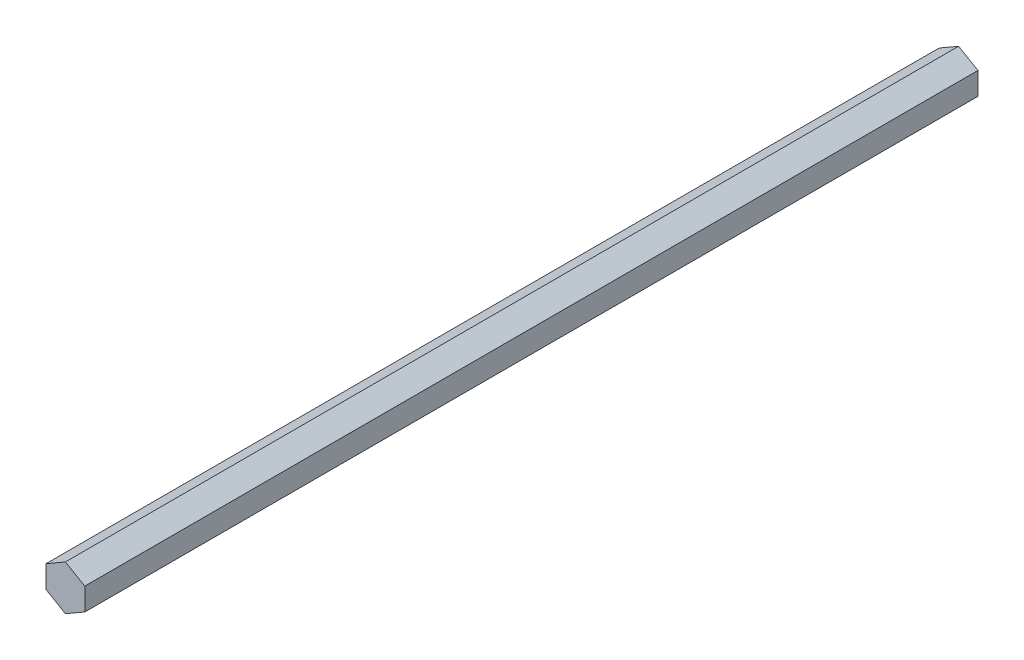
ISO-10303-21;
HEADER;
FILE_DESCRIPTION(('STEP AP214'),'2;1');
FILE_NAME('part.step','',(''),(''),'','','');
FILE_SCHEMA(('AUTOMOTIVE_DESIGN { 1 0 10303 214 1 1 1 1 }'));
ENDSEC;
DATA;
#1=APPLICATION_CONTEXT('core data for automotive mechanical design processes');
#2=APPLICATION_PROTOCOL_DEFINITION('international standard','automotive_design',2000,#1);
#3=PRODUCT_CONTEXT('',#1,'mechanical');
#4=PRODUCT('Part','Part','',(#3));
#5=PRODUCT_RELATED_PRODUCT_CATEGORY('part','',(#4));
#6=PRODUCT_DEFINITION_FORMATION('','',#4);
#7=PRODUCT_DEFINITION_CONTEXT('part definition',#1,'design');
#8=PRODUCT_DEFINITION('design','',#6,#7);
#9=PRODUCT_DEFINITION_SHAPE('','',#8);
#10=(LENGTH_UNIT() NAMED_UNIT(*) SI_UNIT(.MILLI.,.METRE.));
#11=(NAMED_UNIT(*) PLANE_ANGLE_UNIT() SI_UNIT($,.RADIAN.));
#12=(NAMED_UNIT(*) SI_UNIT($,.STERADIAN.) SOLID_ANGLE_UNIT());
#13=UNCERTAINTY_MEASURE_WITH_UNIT(LENGTH_MEASURE(1.E-05),#10,'distance_accuracy_value','');
#14=(GEOMETRIC_REPRESENTATION_CONTEXT(3) GLOBAL_UNCERTAINTY_ASSIGNED_CONTEXT((#13)) GLOBAL_UNIT_ASSIGNED_CONTEXT((#10,
#11,#12)) REPRESENTATION_CONTEXT('',''));
#15=CARTESIAN_POINT('',(0.,0.,0.));
#16=DIRECTION('',(0.,0.,1.));
#17=DIRECTION('',(1.,0.,0.));
#18=AXIS2_PLACEMENT_3D('',#15,#16,#17);
#19=CARTESIAN_POINT('',(6.35,-3.66617420935413,292.1));
#20=DIRECTION('',(-1.,0.,0.));
#21=DIRECTION('',(0.,-1.,0.));
#22=AXIS2_PLACEMENT_3D('',#19,#20,#21);
#23=PLANE('',#22);
#24=DIRECTION('',(0.,1.,0.));
#25=VECTOR('',#24,1.);
#26=CARTESIAN_POINT('',(6.35,-3.66617420935413,0.));
#27=LINE('',#26,#25);
#28=CARTESIAN_POINT('',(6.35,-3.66617420935413,0.));
#29=VERTEX_POINT('',#28);
#30=CARTESIAN_POINT('',(6.35,3.66617420935413,0.));
#31=VERTEX_POINT('',#30);
#32=EDGE_CURVE('E120',#29,#31,#27,.T.);
#33=ORIENTED_EDGE('',*,*,#32,.T.);
#34=DIRECTION('',(0.,0.,-1.));
#35=VECTOR('',#34,1.);
#36=CARTESIAN_POINT('',(6.35,3.66617420935413,292.1));
#37=LINE('',#36,#35);
#38=CARTESIAN_POINT('',(6.35,3.66617420935413,292.1));
#39=VERTEX_POINT('',#38);
#40=EDGE_CURVE('E11',#39,#31,#37,.T.);
#41=ORIENTED_EDGE('',*,*,#40,.F.);
#42=DIRECTION('',(0.,1.,0.));
#43=VECTOR('',#42,1.);
#44=CARTESIAN_POINT('',(6.35,-3.66617420935413,292.1));
#45=LINE('',#44,#43);
#46=CARTESIAN_POINT('',(6.35,-3.66617420935413,292.1));
#47=VERTEX_POINT('',#46);
#48=EDGE_CURVE('E130',#47,#39,#45,.T.);
#49=ORIENTED_EDGE('',*,*,#48,.F.);
#50=DIRECTION('',(0.,0.,-1.));
#51=VECTOR('',#50,1.);
#52=CARTESIAN_POINT('',(6.35,-3.66617420935413,292.1));
#53=LINE('',#52,#51);
#54=EDGE_CURVE('E116',#47,#29,#53,.T.);
#55=ORIENTED_EDGE('',*,*,#54,.T.);
#56=EDGE_LOOP('',(#33,#41,#49,#55));
#57=FACE_BOUND('',#56,.T.);
#58=ADVANCED_FACE('F36',(#57),#23,.F.);
#59=CARTESIAN_POINT('',(6.35,3.66617420935413,292.1));
#60=DIRECTION('',(-0.5,-0.866025403784439,0.));
#61=DIRECTION('',(0.866025403784439,-0.5,0.));
#62=AXIS2_PLACEMENT_3D('',#59,#60,#61);
#63=PLANE('',#62);
#64=DIRECTION('',(-0.866025403784439,0.5,0.));
#65=VECTOR('',#64,1.);
#66=CARTESIAN_POINT('',(6.35,3.66617420935413,0.));
#67=LINE('',#66,#65);
#68=CARTESIAN_POINT('',(0.,7.33234841870825,0.));
#69=VERTEX_POINT('',#68);
#70=EDGE_CURVE('E123',#31,#69,#67,.T.);
#71=ORIENTED_EDGE('',*,*,#70,.T.);
#72=DIRECTION('',(0.,0.,-1.));
#73=VECTOR('',#72,1.);
#74=CARTESIAN_POINT('',(0.,7.33234841870825,292.1));
#75=LINE('',#74,#73);
#76=CARTESIAN_POINT('',(0.,7.33234841870825,292.1));
#77=VERTEX_POINT('',#76);
#78=EDGE_CURVE('E44',#77,#69,#75,.T.);
#79=ORIENTED_EDGE('',*,*,#78,.F.);
#80=DIRECTION('',(-0.866025403784439,0.5,0.));
#81=VECTOR('',#80,1.);
#82=CARTESIAN_POINT('',(6.35,3.66617420935413,292.1));
#83=LINE('',#82,#81);
#84=EDGE_CURVE('E89',#39,#77,#83,.T.);
#85=ORIENTED_EDGE('',*,*,#84,.F.);
#86=ORIENTED_EDGE('',*,*,#40,.T.);
#87=EDGE_LOOP('',(#71,#79,#85,#86));
#88=FACE_BOUND('',#87,.T.);
#89=ADVANCED_FACE('F154',(#88),#63,.F.);
#90=CARTESIAN_POINT('',(0.,7.33234841870825,292.1));
#91=DIRECTION('',(0.5,-0.866025403784439,0.));
#92=DIRECTION('',(0.866025403784439,0.5,0.));
#93=AXIS2_PLACEMENT_3D('',#90,#91,#92);
#94=PLANE('',#93);
#95=DIRECTION('',(-0.866025403784438,-0.5,0.));
#96=VECTOR('',#95,1.);
#97=CARTESIAN_POINT('',(0.,7.33234841870825,0.));
#98=LINE('',#97,#96);
#99=CARTESIAN_POINT('',(-6.35,3.66617420935412,0.));
#100=VERTEX_POINT('',#99);
#101=EDGE_CURVE('E125',#69,#100,#98,.T.);
#102=ORIENTED_EDGE('',*,*,#101,.T.);
#103=DIRECTION('',(0.,0.,-1.));
#104=VECTOR('',#103,1.);
#105=CARTESIAN_POINT('',(-6.35,3.66617420935412,292.1));
#106=LINE('',#105,#104);
#107=CARTESIAN_POINT('',(-6.35,3.66617420935412,292.1));
#108=VERTEX_POINT('',#107);
#109=EDGE_CURVE('E111',#108,#100,#106,.T.);
#110=ORIENTED_EDGE('',*,*,#109,.F.);
#111=DIRECTION('',(-0.866025403784438,-0.5,0.));
#112=VECTOR('',#111,1.);
#113=CARTESIAN_POINT('',(0.,7.33234841870825,292.1));
#114=LINE('',#113,#112);
#115=EDGE_CURVE('E102',#77,#108,#114,.T.);
#116=ORIENTED_EDGE('',*,*,#115,.F.);
#117=ORIENTED_EDGE('',*,*,#78,.T.);
#118=EDGE_LOOP('',(#102,#110,#116,#117));
#119=FACE_BOUND('',#118,.T.);
#120=ADVANCED_FACE('F136',(#119),#94,.F.);
#121=CARTESIAN_POINT('',(-6.35,3.66617420935412,292.1));
#122=DIRECTION('',(1.,0.,0.));
#123=DIRECTION('',(0.,1.,0.));
#124=AXIS2_PLACEMENT_3D('',#121,#122,#123);
#125=PLANE('',#124);
#126=DIRECTION('',(0.,-1.,0.));
#127=VECTOR('',#126,1.);
#128=CARTESIAN_POINT('',(-6.35,3.66617420935412,0.));
#129=LINE('',#128,#127);
#130=CARTESIAN_POINT('',(-6.35,-3.66617420935413,0.));
#131=VERTEX_POINT('',#130);
#132=EDGE_CURVE('E110',#100,#131,#129,.T.);
#133=ORIENTED_EDGE('',*,*,#132,.T.);
#134=DIRECTION('',(0.,0.,-1.));
#135=VECTOR('',#134,1.);
#136=CARTESIAN_POINT('',(-6.35,-3.66617420935413,292.1));
#137=LINE('',#136,#135);
#138=CARTESIAN_POINT('',(-6.35,-3.66617420935413,292.1));
#139=VERTEX_POINT('',#138);
#140=EDGE_CURVE('E107',#139,#131,#137,.T.);
#141=ORIENTED_EDGE('',*,*,#140,.F.);
#142=DIRECTION('',(0.,-1.,0.));
#143=VECTOR('',#142,1.);
#144=CARTESIAN_POINT('',(-6.35,3.66617420935412,292.1));
#145=LINE('',#144,#143);
#146=EDGE_CURVE('E96',#108,#139,#145,.T.);
#147=ORIENTED_EDGE('',*,*,#146,.F.);
#148=ORIENTED_EDGE('',*,*,#109,.T.);
#149=EDGE_LOOP('',(#133,#141,#147,#148));
#150=FACE_BOUND('',#149,.T.);
#151=ADVANCED_FACE('F108',(#150),#125,.F.);
#152=CARTESIAN_POINT('',(-6.35,-3.66617420935413,292.1));
#153=DIRECTION('',(0.5,0.866025403784439,0.));
#154=DIRECTION('',(-0.866025403784439,0.5,0.));
#155=AXIS2_PLACEMENT_3D('',#152,#153,#154);
#156=PLANE('',#155);
#157=DIRECTION('',(0.866025403784439,-0.5,0.));
#158=VECTOR('',#157,1.);
#159=CARTESIAN_POINT('',(-6.35,-3.66617420935413,0.));
#160=LINE('',#159,#158);
#161=CARTESIAN_POINT('',(0.,-7.33234841870825,0.));
#162=VERTEX_POINT('',#161);
#163=EDGE_CURVE('E75',#131,#162,#160,.T.);
#164=ORIENTED_EDGE('',*,*,#163,.T.);
#165=DIRECTION('',(0.,0.,-1.));
#166=VECTOR('',#165,1.);
#167=CARTESIAN_POINT('',(0.,-7.33234841870825,292.1));
#168=LINE('',#167,#166);
#169=CARTESIAN_POINT('',(0.,-7.33234841870825,292.1));
#170=VERTEX_POINT('',#169);
#171=EDGE_CURVE('E112',#170,#162,#168,.T.);
#172=ORIENTED_EDGE('',*,*,#171,.F.);
#173=DIRECTION('',(0.866025403784439,-0.5,0.));
#174=VECTOR('',#173,1.);
#175=CARTESIAN_POINT('',(-6.35,-3.66617420935413,292.1));
#176=LINE('',#175,#174);
#177=EDGE_CURVE('E100',#139,#170,#176,.T.);
#178=ORIENTED_EDGE('',*,*,#177,.F.);
#179=ORIENTED_EDGE('',*,*,#140,.T.);
#180=EDGE_LOOP('',(#164,#172,#178,#179));
#181=FACE_BOUND('',#180,.T.);
#182=ADVANCED_FACE('F114',(#181),#156,.F.);
#183=CARTESIAN_POINT('',(0.,-7.33234841870825,292.1));
#184=DIRECTION('',(-0.5,0.866025403784439,0.));
#185=DIRECTION('',(-0.866025403784439,-0.5,0.));
#186=AXIS2_PLACEMENT_3D('',#183,#184,#185);
#187=PLANE('',#186);
#188=DIRECTION('',(0.866025403784439,0.5,0.));
#189=VECTOR('',#188,1.);
#190=CARTESIAN_POINT('',(0.,-7.33234841870825,0.));
#191=LINE('',#190,#189);
#192=EDGE_CURVE('E81',#162,#29,#191,.T.);
#193=ORIENTED_EDGE('',*,*,#192,.T.);
#194=ORIENTED_EDGE('',*,*,#54,.F.);
#195=DIRECTION('',(0.866025403784439,0.5,0.));
#196=VECTOR('',#195,1.);
#197=CARTESIAN_POINT('',(0.,-7.33234841870825,292.1));
#198=LINE('',#197,#196);
#199=EDGE_CURVE('E52',#170,#47,#198,.T.);
#200=ORIENTED_EDGE('',*,*,#199,.F.);
#201=ORIENTED_EDGE('',*,*,#171,.T.);
#202=EDGE_LOOP('',(#193,#194,#200,#201));
#203=FACE_BOUND('',#202,.T.);
#204=ADVANCED_FACE('F143',(#203),#187,.F.);
#205=CARTESIAN_POINT('',(0.,0.,292.1));
#206=DIRECTION('',(0.,0.,1.));
#207=DIRECTION('',(1.,0.,0.));
#208=AXIS2_PLACEMENT_3D('',#205,#206,#207);
#209=PLANE('',#208);
#210=ORIENTED_EDGE('',*,*,#48,.T.);
#211=ORIENTED_EDGE('',*,*,#84,.T.);
#212=ORIENTED_EDGE('',*,*,#115,.T.);
#213=ORIENTED_EDGE('',*,*,#146,.T.);
#214=ORIENTED_EDGE('',*,*,#177,.T.);
#215=ORIENTED_EDGE('',*,*,#199,.T.);
#216=EDGE_LOOP('',(#210,#211,#212,#213,#214,#215));
#217=FACE_BOUND('',#216,.T.);
#218=ADVANCED_FACE('F98',(#217),#209,.T.);
#219=CARTESIAN_POINT('',(0.,0.,0.));
#220=DIRECTION('',(0.,0.,1.));
#221=DIRECTION('',(1.,0.,0.));
#222=AXIS2_PLACEMENT_3D('',#219,#220,#221);
#223=PLANE('',#222);
#224=ORIENTED_EDGE('',*,*,#32,.F.);
#225=ORIENTED_EDGE('',*,*,#192,.F.);
#226=ORIENTED_EDGE('',*,*,#163,.F.);
#227=ORIENTED_EDGE('',*,*,#132,.F.);
#228=ORIENTED_EDGE('',*,*,#101,.F.);
#229=ORIENTED_EDGE('',*,*,#70,.F.);
#230=EDGE_LOOP('',(#224,#225,#226,#227,#228,#229));
#231=FACE_BOUND('',#230,.T.);
#232=ADVANCED_FACE('F139',(#231),#223,.F.);
#233=CLOSED_SHELL('',(#58,#89,#120,#151,#182,#204,#218,#232));
#234=MANIFOLD_SOLID_BREP('B2',#233);
#235=ADVANCED_BREP_SHAPE_REPRESENTATION('',(#18,#234),#14);
#236=SHAPE_DEFINITION_REPRESENTATION(#9,#235);
ENDSEC;
END-ISO-10303-21;
